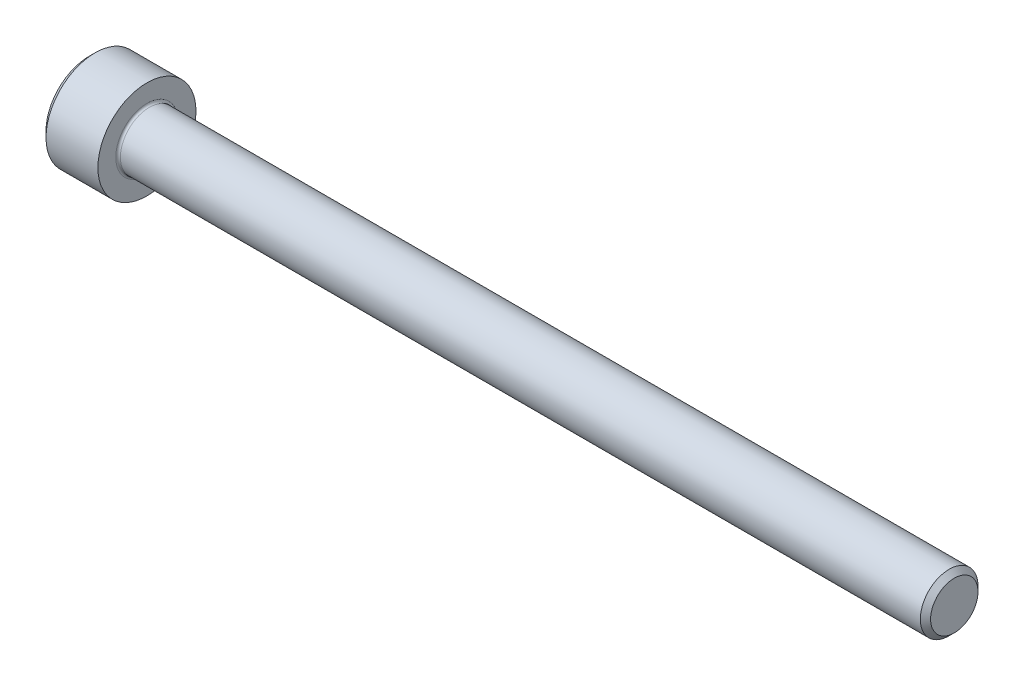
ISO-10303-21;
HEADER;
FILE_DESCRIPTION(('STEP AP214'),'2;1');
FILE_NAME('part.step','',(''),(''),'','','');
FILE_SCHEMA(('AUTOMOTIVE_DESIGN { 1 0 10303 214 1 1 1 1 }'));
ENDSEC;
DATA;
#1=APPLICATION_CONTEXT('core data for automotive mechanical design processes');
#2=APPLICATION_PROTOCOL_DEFINITION('international standard','automotive_design',2000,#1);
#3=PRODUCT_CONTEXT('',#1,'mechanical');
#4=PRODUCT('Part','Part','',(#3));
#5=PRODUCT_RELATED_PRODUCT_CATEGORY('part','',(#4));
#6=PRODUCT_DEFINITION_FORMATION('','',#4);
#7=PRODUCT_DEFINITION_CONTEXT('part definition',#1,'design');
#8=PRODUCT_DEFINITION('design','',#6,#7);
#9=PRODUCT_DEFINITION_SHAPE('','',#8);
#10=(LENGTH_UNIT() NAMED_UNIT(*) SI_UNIT(.MILLI.,.METRE.));
#11=(NAMED_UNIT(*) PLANE_ANGLE_UNIT() SI_UNIT($,.RADIAN.));
#12=(NAMED_UNIT(*) SI_UNIT($,.STERADIAN.) SOLID_ANGLE_UNIT());
#13=UNCERTAINTY_MEASURE_WITH_UNIT(LENGTH_MEASURE(1.E-05),#10,'distance_accuracy_value','');
#14=(GEOMETRIC_REPRESENTATION_CONTEXT(3) GLOBAL_UNCERTAINTY_ASSIGNED_CONTEXT((#13)) GLOBAL_UNIT_ASSIGNED_CONTEXT((#10,
#11,#12)) REPRESENTATION_CONTEXT('',''));
#15=CARTESIAN_POINT('',(0.,0.,0.));
#16=DIRECTION('',(0.,0.,1.));
#17=DIRECTION('',(1.,0.,0.));
#18=AXIS2_PLACEMENT_3D('',#15,#16,#17);
#19=CARTESIAN_POINT('',(0.,0.,0.));
#20=DIRECTION('',(-1.,0.,0.));
#21=DIRECTION('',(0.,0.,1.));
#22=AXIS2_PLACEMENT_3D('',#19,#20,#21);
#23=PLANE('',#22);
#24=DIRECTION('',(0.,-0.499999999999999,0.866025403784439));
#25=VECTOR('',#24,1.);
#26=CARTESIAN_POINT('',(0.,2.35789849937043,0.));
#27=LINE('',#26,#25);
#28=CARTESIAN_POINT('',(0.,2.35789849937043,0.));
#29=VERTEX_POINT('',#28);
#30=CARTESIAN_POINT('',(0.,1.17894924968522,2.042));
#31=VERTEX_POINT('',#30);
#32=EDGE_CURVE('E391',#29,#31,#27,.T.);
#33=ORIENTED_EDGE('',*,*,#32,.T.);
#34=DIRECTION('',(0.,1.,0.));
#35=VECTOR('',#34,1.);
#36=CARTESIAN_POINT('',(0.,-1.17894924968522,2.042));
#37=LINE('',#36,#35);
#38=CARTESIAN_POINT('',(0.,-1.17894924968522,2.042));
#39=VERTEX_POINT('',#38);
#40=EDGE_CURVE('E133',#39,#31,#37,.T.);
#41=ORIENTED_EDGE('',*,*,#40,.F.);
#42=DIRECTION('',(0.,-0.500000000000001,-0.866025403784438));
#43=VECTOR('',#42,1.);
#44=CARTESIAN_POINT('',(0.,-1.17894924968522,2.042));
#45=LINE('',#44,#43);
#46=CARTESIAN_POINT('',(0.,-2.35789849937043,0.));
#47=VERTEX_POINT('',#46);
#48=EDGE_CURVE('E394',#39,#47,#45,.T.);
#49=ORIENTED_EDGE('',*,*,#48,.T.);
#50=DIRECTION('',(0.,0.499999999999998,-0.86602540378444));
#51=VECTOR('',#50,1.);
#52=CARTESIAN_POINT('',(0.,-2.35789849937043,0.));
#53=LINE('',#52,#51);
#54=CARTESIAN_POINT('',(0.,-1.17894924968522,-2.042));
#55=VERTEX_POINT('',#54);
#56=EDGE_CURVE('E397',#47,#55,#53,.T.);
#57=ORIENTED_EDGE('',*,*,#56,.T.);
#58=DIRECTION('',(0.,-1.,0.));
#59=VECTOR('',#58,1.);
#60=CARTESIAN_POINT('',(0.,1.17894924968521,-2.042));
#61=LINE('',#60,#59);
#62=CARTESIAN_POINT('',(0.,1.17894924968521,-2.042));
#63=VERTEX_POINT('',#62);
#64=EDGE_CURVE('E400',#63,#55,#61,.T.);
#65=ORIENTED_EDGE('',*,*,#64,.F.);
#66=DIRECTION('',(0.,-0.500000000000001,-0.866025403784438));
#67=VECTOR('',#66,1.);
#68=CARTESIAN_POINT('',(0.,2.35789849937043,0.));
#69=LINE('',#68,#67);
#70=EDGE_CURVE('E128',#29,#63,#69,.T.);
#71=ORIENTED_EDGE('',*,*,#70,.F.);
#72=EDGE_LOOP('',(#33,#41,#49,#57,#65,#71));
#73=FACE_BOUND('',#72,.T.);
#74=CARTESIAN_POINT('',(0.,0.,0.));
#75=DIRECTION('',(-1.,0.,0.));
#76=DIRECTION('',(0.,0.,1.));
#77=AXIS2_PLACEMENT_3D('',#74,#75,#76);
#78=CIRCLE('',#77,3.75);
#79=CARTESIAN_POINT('',(0.,0.,3.75));
#80=VERTEX_POINT('',#79);
#81=EDGE_CURVE('E144',#80,#80,#78,.T.);
#82=ORIENTED_EDGE('',*,*,#81,.T.);
#83=EDGE_LOOP('',(#82));
#84=FACE_BOUND('',#83,.T.);
#85=ADVANCED_FACE('F37',(#73,#84),#23,.T.);
#86=CARTESIAN_POINT('',(75.,2.055,0.));
#87=DIRECTION('',(1.,0.,0.));
#88=DIRECTION('',(0.,0.,-1.));
#89=AXIS2_PLACEMENT_3D('',#86,#87,#88);
#90=PLANE('',#89);
#91=CARTESIAN_POINT('',(75.,0.,0.));
#92=DIRECTION('',(-1.,0.,0.));
#93=DIRECTION('',(0.,0.,1.));
#94=AXIS2_PLACEMENT_3D('',#91,#92,#93);
#95=CIRCLE('',#94,2.055);
#96=CARTESIAN_POINT('',(75.,0.,2.055));
#97=VERTEX_POINT('',#96);
#98=EDGE_CURVE('E157',#97,#97,#95,.T.);
#99=ORIENTED_EDGE('',*,*,#98,.F.);
#100=EDGE_LOOP('',(#99));
#101=FACE_BOUND('',#100,.T.);
#102=ADVANCED_FACE('F178',(#101),#90,.T.);
#103=CARTESIAN_POINT('',(75.,0.,0.));
#104=DIRECTION('',(-1.,0.,0.));
#105=DIRECTION('',(0.,0.,1.));
#106=AXIS2_PLACEMENT_3D('',#103,#104,#105);
#107=CONICAL_SURFACE('',#106,2.055,0.785398163397462);
#108=CARTESIAN_POINT('',(74.555,0.,0.));
#109=DIRECTION('',(-1.,0.,0.));
#110=DIRECTION('',(0.,0.,1.));
#111=AXIS2_PLACEMENT_3D('',#108,#109,#110);
#112=CIRCLE('',#111,2.5);
#113=CARTESIAN_POINT('',(74.555,0.,2.5));
#114=VERTEX_POINT('',#113);
#115=EDGE_CURVE('E154',#114,#114,#112,.T.);
#116=ORIENTED_EDGE('',*,*,#115,.F.);
#117=EDGE_LOOP('',(#116));
#118=FACE_BOUND('',#117,.T.);
#119=ORIENTED_EDGE('',*,*,#98,.T.);
#120=EDGE_LOOP('',(#119));
#121=FACE_BOUND('',#120,.T.);
#122=ADVANCED_FACE('F184',(#118,#121),#107,.T.);
#123=CARTESIAN_POINT('',(-31.75,0.,0.));
#124=DIRECTION('',(-1.,0.,0.));
#125=DIRECTION('',(0.,0.,1.));
#126=AXIS2_PLACEMENT_3D('',#123,#124,#125);
#127=CYLINDRICAL_SURFACE('',#126,2.5);
#128=CARTESIAN_POINT('',(5.2,0.,0.));
#129=DIRECTION('',(1.,0.,0.));
#130=DIRECTION('',(0.,0.,-1.));
#131=AXIS2_PLACEMENT_3D('',#128,#129,#130);
#132=CIRCLE('',#131,2.5);
#133=CARTESIAN_POINT('',(5.2,0.,-2.5));
#134=VERTEX_POINT('',#133);
#135=EDGE_CURVE('E11',#134,#134,#132,.T.);
#136=ORIENTED_EDGE('',*,*,#135,.T.);
#137=EDGE_LOOP('',(#136));
#138=FACE_BOUND('',#137,.T.);
#139=ORIENTED_EDGE('',*,*,#115,.T.);
#140=EDGE_LOOP('',(#139));
#141=FACE_BOUND('',#140,.T.);
#142=ADVANCED_FACE('F195',(#138,#141),#127,.T.);
#143=CARTESIAN_POINT('',(5.,4.25,0.));
#144=DIRECTION('',(1.,0.,0.));
#145=DIRECTION('',(0.,0.,-1.));
#146=AXIS2_PLACEMENT_3D('',#143,#144,#145);
#147=PLANE('',#146);
#148=CARTESIAN_POINT('',(5.,0.,0.));
#149=DIRECTION('',(1.,0.,0.));
#150=DIRECTION('',(0.,0.,-1.));
#151=AXIS2_PLACEMENT_3D('',#148,#149,#150);
#152=CIRCLE('',#151,2.7);
#153=CARTESIAN_POINT('',(5.,0.,-2.7));
#154=VERTEX_POINT('',#153);
#155=EDGE_CURVE('E45',#154,#154,#152,.F.);
#156=ORIENTED_EDGE('',*,*,#155,.T.);
#157=EDGE_LOOP('',(#156));
#158=FACE_BOUND('',#157,.T.);
#159=CARTESIAN_POINT('',(5.,0.,0.));
#160=DIRECTION('',(-1.,0.,0.));
#161=DIRECTION('',(0.,0.,1.));
#162=AXIS2_PLACEMENT_3D('',#159,#160,#161);
#163=CIRCLE('',#162,4.25);
#164=CARTESIAN_POINT('',(5.,0.,4.25));
#165=VERTEX_POINT('',#164);
#166=EDGE_CURVE('E151',#165,#165,#163,.T.);
#167=ORIENTED_EDGE('',*,*,#166,.F.);
#168=EDGE_LOOP('',(#167));
#169=FACE_BOUND('',#168,.T.);
#170=ADVANCED_FACE('F162',(#158,#169),#147,.T.);
#171=CARTESIAN_POINT('',(-31.75,0.,0.));
#172=DIRECTION('',(-1.,0.,0.));
#173=DIRECTION('',(0.,0.,1.));
#174=AXIS2_PLACEMENT_3D('',#171,#172,#173);
#175=CYLINDRICAL_SURFACE('',#174,4.25);
#176=ORIENTED_EDGE('',*,*,#166,.T.);
#177=EDGE_LOOP('',(#176));
#178=FACE_BOUND('',#177,.T.);
#179=CARTESIAN_POINT('',(0.5,0.,0.));
#180=DIRECTION('',(-1.,0.,0.));
#181=DIRECTION('',(0.,0.,1.));
#182=AXIS2_PLACEMENT_3D('',#179,#180,#181);
#183=CIRCLE('',#182,4.25);
#184=CARTESIAN_POINT('',(0.5,0.,4.25));
#185=VERTEX_POINT('',#184);
#186=EDGE_CURVE('E148',#185,#185,#183,.T.);
#187=ORIENTED_EDGE('',*,*,#186,.F.);
#188=EDGE_LOOP('',(#187));
#189=FACE_BOUND('',#188,.T.);
#190=ADVANCED_FACE('F173',(#178,#189),#175,.T.);
#191=CARTESIAN_POINT('',(0.,0.,0.));
#192=DIRECTION('',(1.,0.,0.));
#193=DIRECTION('',(0.,0.,-1.));
#194=AXIS2_PLACEMENT_3D('',#191,#192,#193);
#195=CONICAL_SURFACE('',#194,3.75,0.785398163397443);
#196=ORIENTED_EDGE('',*,*,#186,.T.);
#197=EDGE_LOOP('',(#196));
#198=FACE_BOUND('',#197,.T.);
#199=ORIENTED_EDGE('',*,*,#81,.F.);
#200=EDGE_LOOP('',(#199));
#201=FACE_BOUND('',#200,.T.);
#202=ADVANCED_FACE('F166',(#198,#201),#195,.T.);
#203=CARTESIAN_POINT('',(5.2,0.,0.));
#204=DIRECTION('',(1.,0.,0.));
#205=DIRECTION('',(0.,0.,-1.));
#206=AXIS2_PLACEMENT_3D('',#203,#204,#205);
#207=TOROIDAL_SURFACE('',#206,2.7,0.2);
#208=ORIENTED_EDGE('',*,*,#135,.F.);
#209=EDGE_LOOP('',(#208));
#210=FACE_BOUND('',#209,.T.);
#211=ORIENTED_EDGE('',*,*,#155,.F.);
#212=EDGE_LOOP('',(#211));
#213=FACE_BOUND('',#212,.T.);
#214=ADVANCED_FACE('F39',(#210,#213),#207,.F.);
#215=CARTESIAN_POINT('',(2.5,2.35789849937043,0.));
#216=DIRECTION('',(0.,-0.866025403784439,-0.499999999999999));
#217=DIRECTION('',(0.,0.499999999999999,-0.866025403784439));
#218=AXIS2_PLACEMENT_3D('',#215,#216,#217);
#219=PLANE('',#218);
#220=ORIENTED_EDGE('',*,*,#32,.F.);
#221=DIRECTION('',(-1.,0.,0.));
#222=VECTOR('',#221,1.);
#223=CARTESIAN_POINT('',(2.5,2.35789849937043,0.));
#224=LINE('',#223,#222);
#225=CARTESIAN_POINT('',(2.5,2.35789849937043,0.));
#226=VERTEX_POINT('',#225);
#227=EDGE_CURVE('E381',#226,#29,#224,.T.);
#228=ORIENTED_EDGE('',*,*,#227,.F.);
#229=DIRECTION('',(0.,-0.499999999999999,0.866025403784439));
#230=VECTOR('',#229,1.);
#231=CARTESIAN_POINT('',(2.5,2.35789849937043,0.));
#232=LINE('',#231,#230);
#233=CARTESIAN_POINT('',(2.5,1.76842387452782,1.021));
#234=VERTEX_POINT('',#233);
#235=EDGE_CURVE('E120',#226,#234,#232,.T.);
#236=ORIENTED_EDGE('',*,*,#235,.T.);
#237=CARTESIAN_POINT('',(2.5,1.17894924968522,2.042));
#238=VERTEX_POINT('',#237);
#239=EDGE_CURVE('E111',#234,#238,#232,.T.);
#240=ORIENTED_EDGE('',*,*,#239,.T.);
#241=DIRECTION('',(-1.,0.,0.));
#242=VECTOR('',#241,1.);
#243=CARTESIAN_POINT('',(2.5,1.17894924968522,2.042));
#244=LINE('',#243,#242);
#245=EDGE_CURVE('E125',#238,#31,#244,.T.);
#246=ORIENTED_EDGE('',*,*,#245,.T.);
#247=EDGE_LOOP('',(#220,#228,#236,#240,#246));
#248=FACE_BOUND('',#247,.T.);
#249=ADVANCED_FACE('F124',(#248),#219,.T.);
#250=CARTESIAN_POINT('',(2.5,-1.17894924968522,2.042));
#251=DIRECTION('',(0.,0.,1.));
#252=DIRECTION('',(0.,-1.,0.));
#253=AXIS2_PLACEMENT_3D('',#250,#251,#252);
#254=PLANE('',#253);
#255=ORIENTED_EDGE('',*,*,#40,.T.);
#256=ORIENTED_EDGE('',*,*,#245,.F.);
#257=DIRECTION('',(0.,1.,0.));
#258=VECTOR('',#257,1.);
#259=CARTESIAN_POINT('',(2.5,-1.17894924968522,2.042));
#260=LINE('',#259,#258);
#261=CARTESIAN_POINT('',(2.5,0.,2.042));
#262=VERTEX_POINT('',#261);
#263=EDGE_CURVE('E108',#262,#238,#260,.T.);
#264=ORIENTED_EDGE('',*,*,#263,.F.);
#265=CARTESIAN_POINT('',(2.5,-1.17894924968522,2.042));
#266=VERTEX_POINT('',#265);
#267=EDGE_CURVE('E119',#266,#262,#260,.T.);
#268=ORIENTED_EDGE('',*,*,#267,.F.);
#269=DIRECTION('',(-1.,0.,0.));
#270=VECTOR('',#269,1.);
#271=CARTESIAN_POINT('',(2.5,-1.17894924968522,2.042));
#272=LINE('',#271,#270);
#273=EDGE_CURVE('E135',#266,#39,#272,.T.);
#274=ORIENTED_EDGE('',*,*,#273,.T.);
#275=EDGE_LOOP('',(#255,#256,#264,#268,#274));
#276=FACE_BOUND('',#275,.T.);
#277=ADVANCED_FACE('F130',(#276),#254,.F.);
#278=CARTESIAN_POINT('',(2.5,-1.17894924968522,2.042));
#279=DIRECTION('',(0.,0.866025403784438,-0.500000000000001));
#280=DIRECTION('',(0.,0.500000000000001,0.866025403784438));
#281=AXIS2_PLACEMENT_3D('',#278,#279,#280);
#282=PLANE('',#281);
#283=ORIENTED_EDGE('',*,*,#48,.F.);
#284=ORIENTED_EDGE('',*,*,#273,.F.);
#285=DIRECTION('',(0.,-0.500000000000001,-0.866025403784438));
#286=VECTOR('',#285,1.);
#287=CARTESIAN_POINT('',(2.5,-1.17894924968522,2.042));
#288=LINE('',#287,#286);
#289=CARTESIAN_POINT('',(2.5,-1.76842387452782,1.021));
#290=VERTEX_POINT('',#289);
#291=EDGE_CURVE('E420',#266,#290,#288,.T.);
#292=ORIENTED_EDGE('',*,*,#291,.T.);
#293=CARTESIAN_POINT('',(2.5,-2.35789849937043,0.));
#294=VERTEX_POINT('',#293);
#295=EDGE_CURVE('E409',#290,#294,#288,.T.);
#296=ORIENTED_EDGE('',*,*,#295,.T.);
#297=DIRECTION('',(-1.,0.,0.));
#298=VECTOR('',#297,1.);
#299=CARTESIAN_POINT('',(2.5,-2.35789849937043,0.));
#300=LINE('',#299,#298);
#301=EDGE_CURVE('E140',#294,#47,#300,.T.);
#302=ORIENTED_EDGE('',*,*,#301,.T.);
#303=EDGE_LOOP('',(#283,#284,#292,#296,#302));
#304=FACE_BOUND('',#303,.T.);
#305=ADVANCED_FACE('F272',(#304),#282,.T.);
#306=CARTESIAN_POINT('',(2.5,-2.35789849937043,0.));
#307=DIRECTION('',(0.,0.86602540378444,0.499999999999998));
#308=DIRECTION('',(0.,-0.499999999999998,0.86602540378444));
#309=AXIS2_PLACEMENT_3D('',#306,#307,#308);
#310=PLANE('',#309);
#311=ORIENTED_EDGE('',*,*,#56,.F.);
#312=ORIENTED_EDGE('',*,*,#301,.F.);
#313=DIRECTION('',(0.,0.499999999999998,-0.86602540378444));
#314=VECTOR('',#313,1.);
#315=CARTESIAN_POINT('',(2.5,-2.35789849937043,0.));
#316=LINE('',#315,#314);
#317=CARTESIAN_POINT('',(2.5,-1.76842387452783,-1.021));
#318=VERTEX_POINT('',#317);
#319=EDGE_CURVE('E387',#294,#318,#316,.T.);
#320=ORIENTED_EDGE('',*,*,#319,.T.);
#321=CARTESIAN_POINT('',(2.5,-1.17894924968522,-2.042));
#322=VERTEX_POINT('',#321);
#323=EDGE_CURVE('E419',#318,#322,#316,.T.);
#324=ORIENTED_EDGE('',*,*,#323,.T.);
#325=DIRECTION('',(-1.,0.,0.));
#326=VECTOR('',#325,1.);
#327=CARTESIAN_POINT('',(2.5,-1.17894924968522,-2.042));
#328=LINE('',#327,#326);
#329=EDGE_CURVE('E380',#322,#55,#328,.T.);
#330=ORIENTED_EDGE('',*,*,#329,.T.);
#331=EDGE_LOOP('',(#311,#312,#320,#324,#330));
#332=FACE_BOUND('',#331,.T.);
#333=ADVANCED_FACE('F280',(#332),#310,.T.);
#334=CARTESIAN_POINT('',(2.5,1.17894924968521,-2.042));
#335=DIRECTION('',(0.,0.,-1.));
#336=DIRECTION('',(0.,1.,0.));
#337=AXIS2_PLACEMENT_3D('',#334,#335,#336);
#338=PLANE('',#337);
#339=ORIENTED_EDGE('',*,*,#64,.T.);
#340=ORIENTED_EDGE('',*,*,#329,.F.);
#341=DIRECTION('',(0.,-1.,0.));
#342=VECTOR('',#341,1.);
#343=CARTESIAN_POINT('',(2.5,1.17894924968521,-2.042));
#344=LINE('',#343,#342);
#345=CARTESIAN_POINT('',(2.5,0.,-2.042));
#346=VERTEX_POINT('',#345);
#347=EDGE_CURVE('E384',#346,#322,#344,.T.);
#348=ORIENTED_EDGE('',*,*,#347,.F.);
#349=CARTESIAN_POINT('',(2.5,1.17894924968521,-2.042));
#350=VERTEX_POINT('',#349);
#351=EDGE_CURVE('E52',#350,#346,#344,.T.);
#352=ORIENTED_EDGE('',*,*,#351,.F.);
#353=DIRECTION('',(-1.,0.,0.));
#354=VECTOR('',#353,1.);
#355=CARTESIAN_POINT('',(2.5,1.17894924968521,-2.042));
#356=LINE('',#355,#354);
#357=EDGE_CURVE('E377',#350,#63,#356,.T.);
#358=ORIENTED_EDGE('',*,*,#357,.T.);
#359=EDGE_LOOP('',(#339,#340,#348,#352,#358));
#360=FACE_BOUND('',#359,.T.);
#361=ADVANCED_FACE('F289',(#360),#338,.F.);
#362=CARTESIAN_POINT('',(2.5,2.35789849937043,0.));
#363=DIRECTION('',(0.,0.866025403784438,-0.500000000000001));
#364=DIRECTION('',(0.,0.500000000000001,0.866025403784438));
#365=AXIS2_PLACEMENT_3D('',#362,#363,#364);
#366=PLANE('',#365);
#367=ORIENTED_EDGE('',*,*,#70,.T.);
#368=ORIENTED_EDGE('',*,*,#357,.F.);
#369=DIRECTION('',(0.,-0.500000000000001,-0.866025403784438));
#370=VECTOR('',#369,1.);
#371=CARTESIAN_POINT('',(2.5,2.35789849937043,0.));
#372=LINE('',#371,#370);
#373=CARTESIAN_POINT('',(2.5,1.76842387452782,-1.021));
#374=VERTEX_POINT('',#373);
#375=EDGE_CURVE('E367',#374,#350,#372,.T.);
#376=ORIENTED_EDGE('',*,*,#375,.F.);
#377=EDGE_CURVE('E373',#226,#374,#372,.T.);
#378=ORIENTED_EDGE('',*,*,#377,.F.);
#379=ORIENTED_EDGE('',*,*,#227,.T.);
#380=EDGE_LOOP('',(#367,#368,#376,#378,#379));
#381=FACE_BOUND('',#380,.T.);
#382=ADVANCED_FACE('F298',(#381),#366,.F.);
#383=CARTESIAN_POINT('',(2.5,3.53684774905564,-2.04200000000001));
#384=DIRECTION('',(1.,0.,0.));
#385=DIRECTION('',(0.,0.,-1.));
#386=AXIS2_PLACEMENT_3D('',#383,#384,#385);
#387=PLANE('',#386);
#388=ORIENTED_EDGE('',*,*,#347,.T.);
#389=ORIENTED_EDGE('',*,*,#323,.F.);
#390=CARTESIAN_POINT('',(2.5,0.,0.));
#391=DIRECTION('',(-1.,0.,0.));
#392=DIRECTION('',(0.,0.,1.));
#393=AXIS2_PLACEMENT_3D('',#390,#391,#392);
#394=CIRCLE('',#393,2.042);
#395=EDGE_CURVE('E415',#346,#318,#394,.T.);
#396=ORIENTED_EDGE('',*,*,#395,.F.);
#397=EDGE_LOOP('',(#388,#389,#396));
#398=FACE_BOUND('',#397,.T.);
#399=ADVANCED_FACE('F307',(#398),#387,.F.);
#400=ORIENTED_EDGE('',*,*,#319,.F.);
#401=ORIENTED_EDGE('',*,*,#295,.F.);
#402=EDGE_CURVE('E138',#318,#290,#394,.T.);
#403=ORIENTED_EDGE('',*,*,#402,.F.);
#404=EDGE_LOOP('',(#400,#401,#403));
#405=FACE_BOUND('',#404,.T.);
#406=ADVANCED_FACE('F316',(#405),#387,.F.);
#407=ORIENTED_EDGE('',*,*,#291,.F.);
#408=ORIENTED_EDGE('',*,*,#267,.T.);
#409=EDGE_CURVE('E134',#290,#262,#394,.T.);
#410=ORIENTED_EDGE('',*,*,#409,.F.);
#411=EDGE_LOOP('',(#407,#408,#410));
#412=FACE_BOUND('',#411,.T.);
#413=ADVANCED_FACE('F325',(#412),#387,.F.);
#414=ORIENTED_EDGE('',*,*,#263,.T.);
#415=ORIENTED_EDGE('',*,*,#239,.F.);
#416=EDGE_CURVE('E114',#262,#234,#394,.T.);
#417=ORIENTED_EDGE('',*,*,#416,.F.);
#418=EDGE_LOOP('',(#414,#415,#417));
#419=FACE_BOUND('',#418,.T.);
#420=ADVANCED_FACE('F110',(#419),#387,.F.);
#421=ORIENTED_EDGE('',*,*,#235,.F.);
#422=ORIENTED_EDGE('',*,*,#377,.T.);
#423=EDGE_CURVE('E145',#234,#374,#394,.T.);
#424=ORIENTED_EDGE('',*,*,#423,.F.);
#425=EDGE_LOOP('',(#421,#422,#424));
#426=FACE_BOUND('',#425,.T.);
#427=ADVANCED_FACE('F340',(#426),#387,.F.);
#428=ORIENTED_EDGE('',*,*,#375,.T.);
#429=ORIENTED_EDGE('',*,*,#351,.T.);
#430=EDGE_CURVE('E370',#374,#346,#394,.T.);
#431=ORIENTED_EDGE('',*,*,#430,.F.);
#432=EDGE_LOOP('',(#428,#429,#431));
#433=FACE_BOUND('',#432,.T.);
#434=ADVANCED_FACE('F255',(#433),#387,.F.);
#435=CARTESIAN_POINT('',(2.5,0.,0.));
#436=DIRECTION('',(-1.,0.,0.));
#437=DIRECTION('',(0.,0.,1.));
#438=AXIS2_PLACEMENT_3D('',#435,#436,#437);
#439=CONICAL_SURFACE('',#438,2.042,1.04719755119659);
#440=CARTESIAN_POINT('',(3.67894924968523,0.,0.));
#441=VERTEX_POINT('',#440);
#442=VERTEX_LOOP('',#441);
#443=FACE_BOUND('',#442,.T.);
#444=ORIENTED_EDGE('',*,*,#416,.T.);
#445=ORIENTED_EDGE('',*,*,#423,.T.);
#446=ORIENTED_EDGE('',*,*,#430,.T.);
#447=ORIENTED_EDGE('',*,*,#395,.T.);
#448=ORIENTED_EDGE('',*,*,#402,.T.);
#449=ORIENTED_EDGE('',*,*,#409,.T.);
#450=EDGE_LOOP('',(#444,#445,#446,#447,#448,#449));
#451=FACE_BOUND('',#450,.T.);
#452=ADVANCED_FACE('F188',(#443,#451),#439,.F.);
#453=CLOSED_SHELL('',(#85,#102,#122,#142,#170,#190,#202,#214,#249,#277,#305,#333,#361,#382,#399,
#406,#413,#420,#427,#434,#452));
#454=MANIFOLD_SOLID_BREP('B2',#453);
#455=ADVANCED_BREP_SHAPE_REPRESENTATION('',(#18,#454),#14);
#456=SHAPE_DEFINITION_REPRESENTATION(#9,#455);
ENDSEC;
END-ISO-10303-21;
